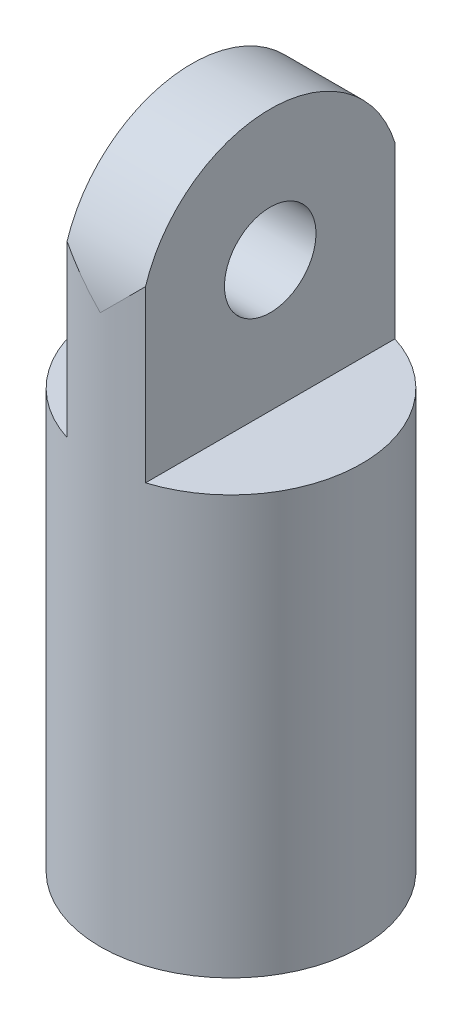
ISO-10303-21;
HEADER;
FILE_DESCRIPTION(('STEP AP214'),'2;1');
FILE_NAME('part.step','',(''),(''),'','','');
FILE_SCHEMA(('AUTOMOTIVE_DESIGN { 1 0 10303 214 1 1 1 1 }'));
ENDSEC;
DATA;
#1=APPLICATION_CONTEXT('core data for automotive mechanical design processes');
#2=APPLICATION_PROTOCOL_DEFINITION('international standard','automotive_design',2000,#1);
#3=PRODUCT_CONTEXT('',#1,'mechanical');
#4=PRODUCT('Part','Part','',(#3));
#5=PRODUCT_RELATED_PRODUCT_CATEGORY('part','',(#4));
#6=PRODUCT_DEFINITION_FORMATION('','',#4);
#7=PRODUCT_DEFINITION_CONTEXT('part definition',#1,'design');
#8=PRODUCT_DEFINITION('design','',#6,#7);
#9=PRODUCT_DEFINITION_SHAPE('','',#8);
#10=(LENGTH_UNIT() NAMED_UNIT(*) SI_UNIT(.MILLI.,.METRE.));
#11=(NAMED_UNIT(*) PLANE_ANGLE_UNIT() SI_UNIT($,.RADIAN.));
#12=(NAMED_UNIT(*) SI_UNIT($,.STERADIAN.) SOLID_ANGLE_UNIT());
#13=UNCERTAINTY_MEASURE_WITH_UNIT(LENGTH_MEASURE(1.E-05),#10,'distance_accuracy_value','');
#14=(GEOMETRIC_REPRESENTATION_CONTEXT(3) GLOBAL_UNCERTAINTY_ASSIGNED_CONTEXT((#13)) GLOBAL_UNIT_ASSIGNED_CONTEXT((#10,
#11,#12)) REPRESENTATION_CONTEXT('',''));
#15=CARTESIAN_POINT('',(0.,0.,0.));
#16=DIRECTION('',(0.,0.,1.));
#17=DIRECTION('',(1.,0.,0.));
#18=AXIS2_PLACEMENT_3D('',#15,#16,#17);
#19=CARTESIAN_POINT('',(-1.5,26.,-4.76969600708473));
#20=DIRECTION('',(1.,0.,0.));
#21=DIRECTION('',(0.,0.,-1.));
#22=AXIS2_PLACEMENT_3D('',#19,#20,#21);
#23=PLANE('',#22);
#24=CARTESIAN_POINT('',(-1.5,21.,0.));
#25=DIRECTION('',(-1.,0.,0.));
#26=DIRECTION('',(0.,0.,1.));
#27=AXIS2_PLACEMENT_3D('',#24,#25,#26);
#28=CIRCLE('',#27,1.75);
#29=CARTESIAN_POINT('',(-1.5,21.,1.75));
#30=VERTEX_POINT('',#29);
#31=EDGE_CURVE('E110',#30,#30,#28,.T.);
#32=ORIENTED_EDGE('',*,*,#31,.F.);
#33=EDGE_LOOP('',(#32));
#34=FACE_BOUND('',#33,.T.);
#35=DIRECTION('',(0.,-1.,0.));
#36=VECTOR('',#35,1.);
#37=CARTESIAN_POINT('',(-1.5,26.,4.76969600708473));
#38=LINE('',#37,#36);
#39=CARTESIAN_POINT('',(-1.5,22.5,4.76969600708473));
#40=VERTEX_POINT('',#39);
#41=CARTESIAN_POINT('',(-1.5,16.,4.76969600708473));
#42=VERTEX_POINT('',#41);
#43=EDGE_CURVE('E132',#40,#42,#38,.T.);
#44=ORIENTED_EDGE('',*,*,#43,.F.);
#45=CARTESIAN_POINT('',(-1.5,21.,0.));
#46=DIRECTION('',(1.,0.,0.));
#47=DIRECTION('',(0.,0.,-1.));
#48=AXIS2_PLACEMENT_3D('',#45,#46,#47);
#49=CIRCLE('',#48,5.);
#50=CARTESIAN_POINT('',(-1.5,22.5,-4.76969600708473));
#51=VERTEX_POINT('',#50);
#52=EDGE_CURVE('E107',#40,#51,#49,.F.);
#53=ORIENTED_EDGE('',*,*,#52,.T.);
#54=DIRECTION('',(0.,-1.,0.));
#55=VECTOR('',#54,1.);
#56=CARTESIAN_POINT('',(-1.5,26.,-4.76969600708473));
#57=LINE('',#56,#55);
#58=CARTESIAN_POINT('',(-1.5,16.,-4.76969600708473));
#59=VERTEX_POINT('',#58);
#60=EDGE_CURVE('E64',#51,#59,#57,.T.);
#61=ORIENTED_EDGE('',*,*,#60,.T.);
#62=DIRECTION('',(0.,0.,1.));
#63=VECTOR('',#62,1.);
#64=CARTESIAN_POINT('',(-1.5,16.,-4.76969600708473));
#65=LINE('',#64,#63);
#66=EDGE_CURVE('E118',#59,#42,#65,.T.);
#67=ORIENTED_EDGE('',*,*,#66,.T.);
#68=EDGE_LOOP('',(#44,#53,#61,#67));
#69=FACE_BOUND('',#68,.T.);
#70=ADVANCED_FACE('F39',(#34,#69),#23,.F.);
#71=CARTESIAN_POINT('',(1.5,26.,-4.76969600708473));
#72=DIRECTION('',(-1.,0.,0.));
#73=DIRECTION('',(0.,0.,1.));
#74=AXIS2_PLACEMENT_3D('',#71,#72,#73);
#75=PLANE('',#74);
#76=CARTESIAN_POINT('',(1.5,21.,0.));
#77=DIRECTION('',(-1.,0.,0.));
#78=DIRECTION('',(0.,0.,1.));
#79=AXIS2_PLACEMENT_3D('',#76,#77,#78);
#80=CIRCLE('',#79,1.75);
#81=CARTESIAN_POINT('',(1.5,21.,1.75));
#82=VERTEX_POINT('',#81);
#83=EDGE_CURVE('E43',#82,#82,#80,.T.);
#84=ORIENTED_EDGE('',*,*,#83,.T.);
#85=EDGE_LOOP('',(#84));
#86=FACE_BOUND('',#85,.T.);
#87=DIRECTION('',(0.,-1.,0.));
#88=VECTOR('',#87,1.);
#89=CARTESIAN_POINT('',(1.5,26.,-4.76969600708473));
#90=LINE('',#89,#88);
#91=CARTESIAN_POINT('',(1.5,22.5,-4.76969600708473));
#92=VERTEX_POINT('',#91);
#93=CARTESIAN_POINT('',(1.5,16.,-4.76969600708473));
#94=VERTEX_POINT('',#93);
#95=EDGE_CURVE('E126',#92,#94,#90,.T.);
#96=ORIENTED_EDGE('',*,*,#95,.F.);
#97=CARTESIAN_POINT('',(1.5,21.,0.));
#98=DIRECTION('',(-1.,0.,0.));
#99=DIRECTION('',(0.,0.,1.));
#100=AXIS2_PLACEMENT_3D('',#97,#98,#99);
#101=CIRCLE('',#100,5.);
#102=CARTESIAN_POINT('',(1.5,22.5,4.76969600708473));
#103=VERTEX_POINT('',#102);
#104=EDGE_CURVE('E92',#92,#103,#101,.F.);
#105=ORIENTED_EDGE('',*,*,#104,.T.);
#106=DIRECTION('',(0.,-1.,0.));
#107=VECTOR('',#106,1.);
#108=CARTESIAN_POINT('',(1.5,26.,4.76969600708473));
#109=LINE('',#108,#107);
#110=CARTESIAN_POINT('',(1.5,16.,4.76969600708473));
#111=VERTEX_POINT('',#110);
#112=EDGE_CURVE('E129',#103,#111,#109,.T.);
#113=ORIENTED_EDGE('',*,*,#112,.T.);
#114=DIRECTION('',(0.,0.,-1.));
#115=VECTOR('',#114,1.);
#116=CARTESIAN_POINT('',(1.5,16.,-4.76969600708473));
#117=LINE('',#116,#115);
#118=EDGE_CURVE('E122',#111,#94,#117,.T.);
#119=ORIENTED_EDGE('',*,*,#118,.T.);
#120=EDGE_LOOP('',(#96,#105,#113,#119));
#121=FACE_BOUND('',#120,.T.);
#122=ADVANCED_FACE('F166',(#86,#121),#75,.F.);
#123=CARTESIAN_POINT('',(0.,16.,0.));
#124=DIRECTION('',(0.,1.,0.));
#125=DIRECTION('',(0.,0.,1.));
#126=AXIS2_PLACEMENT_3D('',#123,#124,#125);
#127=PLANE('',#126);
#128=ORIENTED_EDGE('',*,*,#118,.F.);
#129=CARTESIAN_POINT('',(0.,16.,0.));
#130=DIRECTION('',(0.,1.,0.));
#131=DIRECTION('',(0.,0.,1.));
#132=AXIS2_PLACEMENT_3D('',#129,#130,#131);
#133=CIRCLE('',#132,5.);
#134=EDGE_CURVE('E138',#111,#94,#133,.T.);
#135=ORIENTED_EDGE('',*,*,#134,.T.);
#136=EDGE_LOOP('',(#128,#135));
#137=FACE_BOUND('',#136,.T.);
#138=ADVANCED_FACE('F172',(#137),#127,.T.);
#139=CARTESIAN_POINT('',(0.,0.,0.));
#140=DIRECTION('',(0.,1.,0.));
#141=DIRECTION('',(0.,0.,1.));
#142=AXIS2_PLACEMENT_3D('',#139,#140,#141);
#143=PLANE('',#142);
#144=CARTESIAN_POINT('',(0.,0.,0.));
#145=DIRECTION('',(0.,1.,0.));
#146=DIRECTION('',(0.,0.,1.));
#147=AXIS2_PLACEMENT_3D('',#144,#145,#146);
#148=CIRCLE('',#147,5.);
#149=CARTESIAN_POINT('',(0.,0.,5.));
#150=VERTEX_POINT('',#149);
#151=EDGE_CURVE('E11',#150,#150,#148,.T.);
#152=ORIENTED_EDGE('',*,*,#151,.F.);
#153=EDGE_LOOP('',(#152));
#154=FACE_BOUND('',#153,.T.);
#155=CARTESIAN_POINT('',(0.,0.,0.));
#156=DIRECTION('',(0.,1.,0.));
#157=DIRECTION('',(0.,0.,1.));
#158=AXIS2_PLACEMENT_3D('',#155,#156,#157);
#159=CIRCLE('',#158,3.1);
#160=CARTESIAN_POINT('',(0.,0.,3.1));
#161=VERTEX_POINT('',#160);
#162=EDGE_CURVE('E49',#161,#161,#159,.T.);
#163=ORIENTED_EDGE('',*,*,#162,.T.);
#164=EDGE_LOOP('',(#163));
#165=FACE_BOUND('',#164,.T.);
#166=ADVANCED_FACE('F150',(#154,#165),#143,.F.);
#167=CARTESIAN_POINT('',(0.,15.,0.));
#168=DIRECTION('',(0.,-1.,0.));
#169=DIRECTION('',(0.,0.,-1.));
#170=AXIS2_PLACEMENT_3D('',#167,#168,#169);
#171=CYLINDRICAL_SURFACE('',#170,5.);
#172=ORIENTED_EDGE('',*,*,#151,.T.);
#173=EDGE_LOOP('',(#172));
#174=FACE_BOUND('',#173,.T.);
#175=CARTESIAN_POINT('',(0.,21.,0.));
#176=DIRECTION('',(-0.707106781186547,-0.707106781186547,0.));
#177=DIRECTION('',(0.707106781186547,-0.707106781186547,0.));
#178=AXIS2_PLACEMENT_3D('',#175,#176,#177);
#179=ELLIPSE('',#178,7.07106781186548,5.);
#180=CARTESIAN_POINT('',(0.,21.,-5.));
#181=VERTEX_POINT('',#180);
#182=EDGE_CURVE('E91',#51,#181,#179,.T.);
#183=ORIENTED_EDGE('',*,*,#182,.T.);
#184=CARTESIAN_POINT('',(0.,21.,0.));
#185=DIRECTION('',(0.707106781186547,-0.707106781186547,0.));
#186=DIRECTION('',(-0.707106781186547,-0.707106781186547,0.));
#187=AXIS2_PLACEMENT_3D('',#184,#185,#186);
#188=ELLIPSE('',#187,7.07106781186548,5.);
#189=EDGE_CURVE('E88',#181,#92,#188,.T.);
#190=ORIENTED_EDGE('',*,*,#189,.T.);
#191=ORIENTED_EDGE('',*,*,#95,.T.);
#192=ORIENTED_EDGE('',*,*,#134,.F.);
#193=ORIENTED_EDGE('',*,*,#112,.F.);
#194=CARTESIAN_POINT('',(0.,21.,5.));
#195=VERTEX_POINT('',#194);
#196=EDGE_CURVE('E56',#103,#195,#188,.T.);
#197=ORIENTED_EDGE('',*,*,#196,.T.);
#198=EDGE_CURVE('E96',#195,#40,#179,.T.);
#199=ORIENTED_EDGE('',*,*,#198,.T.);
#200=ORIENTED_EDGE('',*,*,#43,.T.);
#201=EDGE_CURVE('E137',#59,#42,#133,.T.);
#202=ORIENTED_EDGE('',*,*,#201,.F.);
#203=ORIENTED_EDGE('',*,*,#60,.F.);
#204=EDGE_LOOP('',(#183,#190,#191,#192,#193,#197,#199,#200,#202,#203));
#205=FACE_BOUND('',#204,.T.);
#206=ADVANCED_FACE('F41',(#174,#205),#171,.T.);
#207=CARTESIAN_POINT('',(0.,15.,0.));
#208=DIRECTION('',(0.,-1.,0.));
#209=DIRECTION('',(0.,0.,-1.));
#210=AXIS2_PLACEMENT_3D('',#207,#208,#209);
#211=CYLINDRICAL_SURFACE('',#210,3.1);
#212=CARTESIAN_POINT('',(0.,15.,0.));
#213=DIRECTION('',(0.,1.,0.));
#214=DIRECTION('',(0.,0.,1.));
#215=AXIS2_PLACEMENT_3D('',#212,#213,#214);
#216=CIRCLE('',#215,3.1);
#217=CARTESIAN_POINT('',(0.,15.,3.1));
#218=VERTEX_POINT('',#217);
#219=EDGE_CURVE('E142',#218,#218,#216,.T.);
#220=ORIENTED_EDGE('',*,*,#219,.T.);
#221=EDGE_LOOP('',(#220));
#222=FACE_BOUND('',#221,.T.);
#223=ORIENTED_EDGE('',*,*,#162,.F.);
#224=EDGE_LOOP('',(#223));
#225=FACE_BOUND('',#224,.T.);
#226=ADVANCED_FACE('F152',(#222,#225),#211,.F.);
#227=CARTESIAN_POINT('',(0.,15.,0.));
#228=DIRECTION('',(0.,1.,0.));
#229=DIRECTION('',(0.,0.,1.));
#230=AXIS2_PLACEMENT_3D('',#227,#228,#229);
#231=PLANE('',#230);
#232=ORIENTED_EDGE('',*,*,#219,.F.);
#233=EDGE_LOOP('',(#232));
#234=FACE_BOUND('',#233,.T.);
#235=ADVANCED_FACE('F154',(#234),#231,.F.);
#236=ORIENTED_EDGE('',*,*,#66,.F.);
#237=ORIENTED_EDGE('',*,*,#201,.T.);
#238=EDGE_LOOP('',(#236,#237));
#239=FACE_BOUND('',#238,.T.);
#240=ADVANCED_FACE('F161',(#239),#127,.T.);
#241=CARTESIAN_POINT('',(5.,21.,0.));
#242=DIRECTION('',(-1.,0.,0.));
#243=DIRECTION('',(0.,0.,1.));
#244=AXIS2_PLACEMENT_3D('',#241,#242,#243);
#245=CYLINDRICAL_SURFACE('',#244,1.75);
#246=ORIENTED_EDGE('',*,*,#31,.T.);
#247=EDGE_LOOP('',(#246));
#248=FACE_BOUND('',#247,.T.);
#249=ORIENTED_EDGE('',*,*,#83,.F.);
#250=EDGE_LOOP('',(#249));
#251=FACE_BOUND('',#250,.T.);
#252=ADVANCED_FACE('F178',(#248,#251),#245,.F.);
#253=CARTESIAN_POINT('',(-5.,21.,0.));
#254=DIRECTION('',(1.,0.,0.));
#255=DIRECTION('',(0.,0.,-1.));
#256=AXIS2_PLACEMENT_3D('',#253,#254,#255);
#257=CYLINDRICAL_SURFACE('',#256,5.);
#258=ORIENTED_EDGE('',*,*,#198,.F.);
#259=ORIENTED_EDGE('',*,*,#196,.F.);
#260=ORIENTED_EDGE('',*,*,#104,.F.);
#261=ORIENTED_EDGE('',*,*,#189,.F.);
#262=ORIENTED_EDGE('',*,*,#182,.F.);
#263=ORIENTED_EDGE('',*,*,#52,.F.);
#264=EDGE_LOOP('',(#258,#259,#260,#261,#262,#263));
#265=FACE_BOUND('',#264,.T.);
#266=ADVANCED_FACE('F90',(#265),#257,.T.);
#267=CLOSED_SHELL('',(#70,#122,#138,#166,#206,#226,#235,#240,#252,#266));
#268=MANIFOLD_SOLID_BREP('B2',#267);
#269=ADVANCED_BREP_SHAPE_REPRESENTATION('',(#18,#268),#14);
#270=SHAPE_DEFINITION_REPRESENTATION(#9,#269);
ENDSEC;
END-ISO-10303-21;
